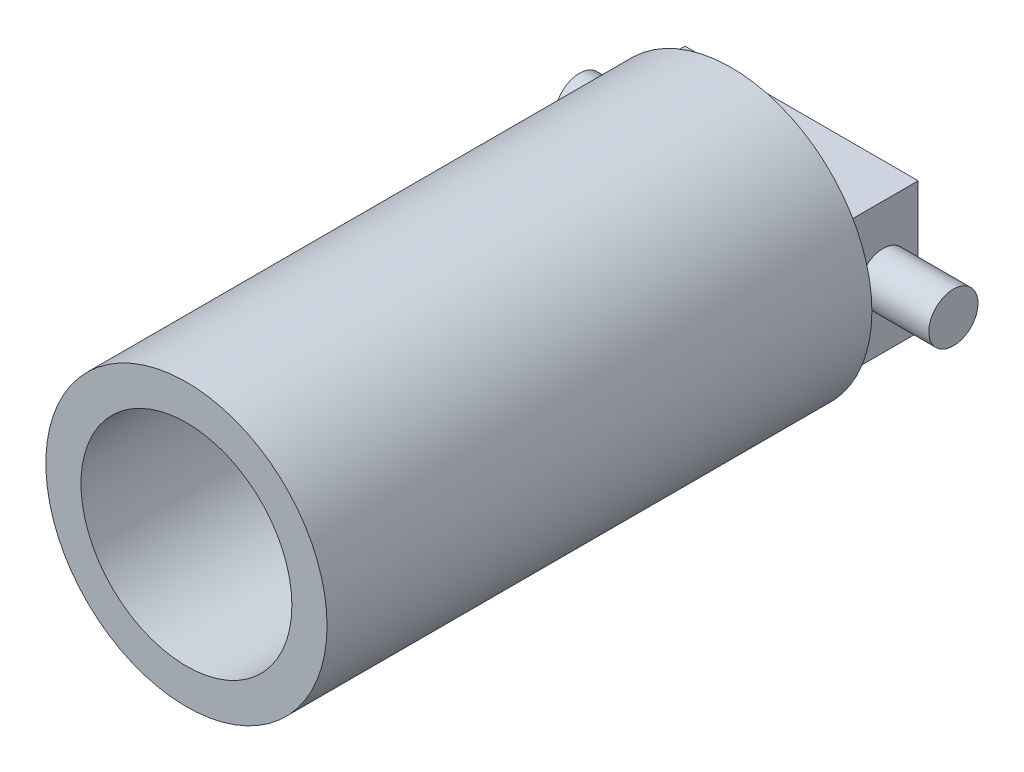
ISO-10303-21;
HEADER;
FILE_DESCRIPTION(('STEP AP214'),'2;1');
FILE_NAME('part.step','',(''),(''),'','','');
FILE_SCHEMA(('AUTOMOTIVE_DESIGN { 1 0 10303 214 1 1 1 1 }'));
ENDSEC;
DATA;
#1=APPLICATION_CONTEXT('core data for automotive mechanical design processes');
#2=APPLICATION_PROTOCOL_DEFINITION('international standard','automotive_design',2000,#1);
#3=PRODUCT_CONTEXT('',#1,'mechanical');
#4=PRODUCT('Part','Part','',(#3));
#5=PRODUCT_RELATED_PRODUCT_CATEGORY('part','',(#4));
#6=PRODUCT_DEFINITION_FORMATION('','',#4);
#7=PRODUCT_DEFINITION_CONTEXT('part definition',#1,'design');
#8=PRODUCT_DEFINITION('design','',#6,#7);
#9=PRODUCT_DEFINITION_SHAPE('','',#8);
#10=(LENGTH_UNIT() NAMED_UNIT(*) SI_UNIT(.MILLI.,.METRE.));
#11=(NAMED_UNIT(*) PLANE_ANGLE_UNIT() SI_UNIT($,.RADIAN.));
#12=(NAMED_UNIT(*) SI_UNIT($,.STERADIAN.) SOLID_ANGLE_UNIT());
#13=UNCERTAINTY_MEASURE_WITH_UNIT(LENGTH_MEASURE(1.E-05),#10,'distance_accuracy_value','');
#14=(GEOMETRIC_REPRESENTATION_CONTEXT(3) GLOBAL_UNCERTAINTY_ASSIGNED_CONTEXT((#13)) GLOBAL_UNIT_ASSIGNED_CONTEXT((#10,
#11,#12)) REPRESENTATION_CONTEXT('',''));
#15=CARTESIAN_POINT('',(0.,0.,0.));
#16=DIRECTION('',(0.,0.,1.));
#17=DIRECTION('',(1.,0.,0.));
#18=AXIS2_PLACEMENT_3D('',#15,#16,#17);
#19=CARTESIAN_POINT('',(0.,0.,0.));
#20=DIRECTION('',(0.,0.,1.));
#21=DIRECTION('',(1.,0.,0.));
#22=AXIS2_PLACEMENT_3D('',#19,#20,#21);
#23=PLANE('',#22);
#24=CARTESIAN_POINT('',(0.,0.,0.));
#25=DIRECTION('',(0.,0.,1.));
#26=DIRECTION('',(1.,0.,0.));
#27=AXIS2_PLACEMENT_3D('',#24,#25,#26);
#28=CIRCLE('',#27,10.16);
#29=CARTESIAN_POINT('',(10.16,0.,0.));
#30=VERTEX_POINT('',#29);
#31=EDGE_CURVE('E126',#30,#30,#28,.T.);
#32=ORIENTED_EDGE('',*,*,#31,.F.);
#33=EDGE_LOOP('',(#32));
#34=FACE_BOUND('',#33,.T.);
#35=DIRECTION('',(0.,1.,0.));
#36=VECTOR('',#35,1.);
#37=CARTESIAN_POINT('',(-8.42913527870695,4.74507265689437,0.));
#38=LINE('',#37,#36);
#39=CARTESIAN_POINT('',(-8.42913527870695,-4.74507265689437,0.));
#40=VERTEX_POINT('',#39);
#41=CARTESIAN_POINT('',(-8.42913527870695,4.74507265689437,0.));
#42=VERTEX_POINT('',#41);
#43=EDGE_CURVE('E59',#40,#42,#38,.T.);
#44=ORIENTED_EDGE('',*,*,#43,.F.);
#45=DIRECTION('',(-1.,0.,0.));
#46=VECTOR('',#45,1.);
#47=CARTESIAN_POINT('',(8.42913527870695,-4.74507265689437,0.));
#48=LINE('',#47,#46);
#49=CARTESIAN_POINT('',(8.42913527870695,-4.74507265689437,0.));
#50=VERTEX_POINT('',#49);
#51=EDGE_CURVE('E63',#50,#40,#48,.T.);
#52=ORIENTED_EDGE('',*,*,#51,.F.);
#53=DIRECTION('',(0.,-1.,0.));
#54=VECTOR('',#53,1.);
#55=CARTESIAN_POINT('',(8.42913527870695,4.74507265689437,0.));
#56=LINE('',#55,#54);
#57=CARTESIAN_POINT('',(8.42913527870695,4.74507265689437,0.));
#58=VERTEX_POINT('',#57);
#59=EDGE_CURVE('E315',#58,#50,#56,.T.);
#60=ORIENTED_EDGE('',*,*,#59,.F.);
#61=DIRECTION('',(1.,0.,0.));
#62=VECTOR('',#61,1.);
#63=CARTESIAN_POINT('',(8.42913527870695,4.74507265689437,0.));
#64=LINE('',#63,#62);
#65=EDGE_CURVE('E312',#42,#58,#64,.T.);
#66=ORIENTED_EDGE('',*,*,#65,.F.);
#67=EDGE_LOOP('',(#44,#52,#60,#66));
#68=FACE_BOUND('',#67,.T.);
#69=ADVANCED_FACE('F43',(#34,#68),#23,.F.);
#70=CARTESIAN_POINT('',(0.,0.,40.64));
#71=DIRECTION('',(0.,0.,-1.));
#72=DIRECTION('',(-1.,0.,0.));
#73=AXIS2_PLACEMENT_3D('',#70,#71,#72);
#74=CYLINDRICAL_SURFACE('',#73,10.16);
#75=ORIENTED_EDGE('',*,*,#31,.T.);
#76=EDGE_LOOP('',(#75));
#77=FACE_BOUND('',#76,.T.);
#78=CARTESIAN_POINT('',(0.,0.,39.37));
#79=DIRECTION('',(0.,0.,1.));
#80=DIRECTION('',(1.,0.,0.));
#81=AXIS2_PLACEMENT_3D('',#78,#79,#80);
#82=CIRCLE('',#81,10.16);
#83=CARTESIAN_POINT('',(10.16,0.,39.37));
#84=VERTEX_POINT('',#83);
#85=EDGE_CURVE('E113',#84,#84,#82,.T.);
#86=ORIENTED_EDGE('',*,*,#85,.F.);
#87=EDGE_LOOP('',(#86));
#88=FACE_BOUND('',#87,.T.);
#89=ADVANCED_FACE('F45',(#77,#88),#74,.T.);
#90=CARTESIAN_POINT('',(0.,0.,39.37));
#91=DIRECTION('',(0.,0.,1.));
#92=DIRECTION('',(1.,0.,0.));
#93=AXIS2_PLACEMENT_3D('',#90,#91,#92);
#94=PLANE('',#93);
#95=CARTESIAN_POINT('',(0.,0.,39.37));
#96=DIRECTION('',(0.,0.,1.));
#97=DIRECTION('',(1.,0.,0.));
#98=AXIS2_PLACEMENT_3D('',#95,#96,#97);
#99=CIRCLE('',#98,7.62);
#100=CARTESIAN_POINT('',(7.62,0.,39.37));
#101=VERTEX_POINT('',#100);
#102=EDGE_CURVE('E108',#101,#101,#99,.T.);
#103=ORIENTED_EDGE('',*,*,#102,.F.);
#104=EDGE_LOOP('',(#103));
#105=FACE_BOUND('',#104,.T.);
#106=ORIENTED_EDGE('',*,*,#85,.T.);
#107=EDGE_LOOP('',(#106));
#108=FACE_BOUND('',#107,.T.);
#109=ADVANCED_FACE('F153',(#105,#108),#94,.T.);
#110=CARTESIAN_POINT('',(0.,0.,39.64));
#111=DIRECTION('',(0.,0.,-1.));
#112=DIRECTION('',(-1.,0.,0.));
#113=AXIS2_PLACEMENT_3D('',#110,#111,#112);
#114=CYLINDRICAL_SURFACE('',#113,7.62);
#115=CARTESIAN_POINT('',(0.,0.,1.));
#116=DIRECTION('',(0.,0.,1.));
#117=DIRECTION('',(1.,0.,0.));
#118=AXIS2_PLACEMENT_3D('',#115,#116,#117);
#119=CIRCLE('',#118,7.62);
#120=CARTESIAN_POINT('',(7.62,0.,1.));
#121=VERTEX_POINT('',#120);
#122=EDGE_CURVE('E122',#121,#121,#119,.T.);
#123=ORIENTED_EDGE('',*,*,#122,.F.);
#124=EDGE_LOOP('',(#123));
#125=FACE_BOUND('',#124,.T.);
#126=ORIENTED_EDGE('',*,*,#102,.T.);
#127=EDGE_LOOP('',(#126));
#128=FACE_BOUND('',#127,.T.);
#129=ADVANCED_FACE('F144',(#125,#128),#114,.F.);
#130=CARTESIAN_POINT('',(0.,0.,1.));
#131=DIRECTION('',(0.,0.,1.));
#132=DIRECTION('',(1.,0.,0.));
#133=AXIS2_PLACEMENT_3D('',#130,#131,#132);
#134=PLANE('',#133);
#135=ORIENTED_EDGE('',*,*,#122,.T.);
#136=EDGE_LOOP('',(#135));
#137=FACE_BOUND('',#136,.T.);
#138=ADVANCED_FACE('F136',(#137),#134,.T.);
#139=CARTESIAN_POINT('',(-8.42913527870695,4.74507265689437,-5.08));
#140=DIRECTION('',(1.,0.,0.));
#141=DIRECTION('',(0.,0.,-1.));
#142=AXIS2_PLACEMENT_3D('',#139,#140,#141);
#143=PLANE('',#142);
#144=CARTESIAN_POINT('',(-8.42913527870695,0.,-2.54));
#145=DIRECTION('',(1.,0.,0.));
#146=DIRECTION('',(0.,0.,-1.));
#147=AXIS2_PLACEMENT_3D('',#144,#145,#146);
#148=CIRCLE('',#147,1.778);
#149=CARTESIAN_POINT('',(-8.42913527870695,0.,-4.318));
#150=VERTEX_POINT('',#149);
#151=EDGE_CURVE('E52',#150,#150,#148,.F.);
#152=ORIENTED_EDGE('',*,*,#151,.F.);
#153=EDGE_LOOP('',(#152));
#154=FACE_BOUND('',#153,.T.);
#155=ORIENTED_EDGE('',*,*,#43,.T.);
#156=DIRECTION('',(0.,0.,1.));
#157=VECTOR('',#156,1.);
#158=CARTESIAN_POINT('',(-8.42913527870695,4.74507265689437,-5.08));
#159=LINE('',#158,#157);
#160=CARTESIAN_POINT('',(-8.42913527870695,4.74507265689437,-5.08));
#161=VERTEX_POINT('',#160);
#162=EDGE_CURVE('E88',#161,#42,#159,.T.);
#163=ORIENTED_EDGE('',*,*,#162,.F.);
#164=DIRECTION('',(0.,1.,0.));
#165=VECTOR('',#164,1.);
#166=CARTESIAN_POINT('',(-8.42913527870695,4.74507265689437,-5.08));
#167=LINE('',#166,#165);
#168=CARTESIAN_POINT('',(-8.42913527870695,-4.74507265689437,-5.08));
#169=VERTEX_POINT('',#168);
#170=EDGE_CURVE('E95',#169,#161,#167,.T.);
#171=ORIENTED_EDGE('',*,*,#170,.F.);
#172=DIRECTION('',(0.,0.,1.));
#173=VECTOR('',#172,1.);
#174=CARTESIAN_POINT('',(-8.42913527870695,-4.74507265689437,-5.08));
#175=LINE('',#174,#173);
#176=EDGE_CURVE('E309',#169,#40,#175,.T.);
#177=ORIENTED_EDGE('',*,*,#176,.T.);
#178=EDGE_LOOP('',(#155,#163,#171,#177));
#179=FACE_BOUND('',#178,.T.);
#180=ADVANCED_FACE('F106',(#154,#179),#143,.F.);
#181=CARTESIAN_POINT('',(8.42913527870695,4.74507265689437,-5.08));
#182=DIRECTION('',(0.,-1.,0.));
#183=DIRECTION('',(0.,0.,-1.));
#184=AXIS2_PLACEMENT_3D('',#181,#182,#183);
#185=PLANE('',#184);
#186=ORIENTED_EDGE('',*,*,#65,.T.);
#187=DIRECTION('',(0.,0.,1.));
#188=VECTOR('',#187,1.);
#189=CARTESIAN_POINT('',(8.42913527870695,4.74507265689437,-5.08));
#190=LINE('',#189,#188);
#191=CARTESIAN_POINT('',(8.42913527870695,4.74507265689437,-5.08));
#192=VERTEX_POINT('',#191);
#193=EDGE_CURVE('E90',#192,#58,#190,.T.);
#194=ORIENTED_EDGE('',*,*,#193,.F.);
#195=DIRECTION('',(1.,0.,0.));
#196=VECTOR('',#195,1.);
#197=CARTESIAN_POINT('',(8.42913527870695,4.74507265689437,-5.08));
#198=LINE('',#197,#196);
#199=EDGE_CURVE('E83',#161,#192,#198,.T.);
#200=ORIENTED_EDGE('',*,*,#199,.F.);
#201=ORIENTED_EDGE('',*,*,#162,.T.);
#202=EDGE_LOOP('',(#186,#194,#200,#201));
#203=FACE_BOUND('',#202,.T.);
#204=ADVANCED_FACE('F86',(#203),#185,.F.);
#205=CARTESIAN_POINT('',(8.42913527870695,4.74507265689437,-5.08));
#206=DIRECTION('',(-1.,0.,0.));
#207=DIRECTION('',(0.,0.,1.));
#208=AXIS2_PLACEMENT_3D('',#205,#206,#207);
#209=PLANE('',#208);
#210=CARTESIAN_POINT('',(8.42913527870695,0.,-2.54));
#211=DIRECTION('',(-1.,0.,0.));
#212=DIRECTION('',(0.,0.,1.));
#213=AXIS2_PLACEMENT_3D('',#210,#211,#212);
#214=CIRCLE('',#213,1.778);
#215=CARTESIAN_POINT('',(8.42913527870695,0.,-0.762));
#216=VERTEX_POINT('',#215);
#217=EDGE_CURVE('E11',#216,#216,#214,.F.);
#218=ORIENTED_EDGE('',*,*,#217,.F.);
#219=EDGE_LOOP('',(#218));
#220=FACE_BOUND('',#219,.T.);
#221=ORIENTED_EDGE('',*,*,#59,.T.);
#222=DIRECTION('',(0.,0.,1.));
#223=VECTOR('',#222,1.);
#224=CARTESIAN_POINT('',(8.42913527870695,-4.74507265689437,-5.08));
#225=LINE('',#224,#223);
#226=CARTESIAN_POINT('',(8.42913527870695,-4.74507265689437,-5.08));
#227=VERTEX_POINT('',#226);
#228=EDGE_CURVE('E115',#227,#50,#225,.T.);
#229=ORIENTED_EDGE('',*,*,#228,.F.);
#230=DIRECTION('',(0.,-1.,0.));
#231=VECTOR('',#230,1.);
#232=CARTESIAN_POINT('',(8.42913527870695,4.74507265689437,-5.08));
#233=LINE('',#232,#231);
#234=EDGE_CURVE('E94',#192,#227,#233,.T.);
#235=ORIENTED_EDGE('',*,*,#234,.F.);
#236=ORIENTED_EDGE('',*,*,#193,.T.);
#237=EDGE_LOOP('',(#221,#229,#235,#236));
#238=FACE_BOUND('',#237,.T.);
#239=ADVANCED_FACE('F142',(#220,#238),#209,.F.);
#240=CARTESIAN_POINT('',(8.42913527870695,-4.74507265689437,-5.08));
#241=DIRECTION('',(0.,1.,0.));
#242=DIRECTION('',(0.,0.,1.));
#243=AXIS2_PLACEMENT_3D('',#240,#241,#242);
#244=PLANE('',#243);
#245=ORIENTED_EDGE('',*,*,#51,.T.);
#246=ORIENTED_EDGE('',*,*,#176,.F.);
#247=DIRECTION('',(-1.,0.,0.));
#248=VECTOR('',#247,1.);
#249=CARTESIAN_POINT('',(8.42913527870695,-4.74507265689437,-5.08));
#250=LINE('',#249,#248);
#251=EDGE_CURVE('E100',#227,#169,#250,.T.);
#252=ORIENTED_EDGE('',*,*,#251,.F.);
#253=ORIENTED_EDGE('',*,*,#228,.T.);
#254=EDGE_LOOP('',(#245,#246,#252,#253));
#255=FACE_BOUND('',#254,.T.);
#256=ADVANCED_FACE('F217',(#255),#244,.F.);
#257=CARTESIAN_POINT('',(0.,0.,-5.08));
#258=DIRECTION('',(0.,0.,-1.));
#259=DIRECTION('',(-1.,0.,0.));
#260=AXIS2_PLACEMENT_3D('',#257,#258,#259);
#261=PLANE('',#260);
#262=ORIENTED_EDGE('',*,*,#170,.T.);
#263=ORIENTED_EDGE('',*,*,#199,.T.);
#264=ORIENTED_EDGE('',*,*,#234,.T.);
#265=ORIENTED_EDGE('',*,*,#251,.T.);
#266=EDGE_LOOP('',(#262,#263,#264,#265));
#267=FACE_BOUND('',#266,.T.);
#268=ADVANCED_FACE('F98',(#267),#261,.T.);
#269=CARTESIAN_POINT('',(-13.509135278707,0.,-2.54));
#270=DIRECTION('',(1.,0.,0.));
#271=DIRECTION('',(0.,0.,-1.));
#272=AXIS2_PLACEMENT_3D('',#269,#270,#271);
#273=CYLINDRICAL_SURFACE('',#272,1.778);
#274=CARTESIAN_POINT('',(-13.509135278707,0.,-2.54));
#275=DIRECTION('',(-1.,0.,0.));
#276=DIRECTION('',(0.,0.,1.));
#277=AXIS2_PLACEMENT_3D('',#274,#275,#276);
#278=CIRCLE('',#277,1.778);
#279=CARTESIAN_POINT('',(-13.509135278707,0.,-0.762));
#280=VERTEX_POINT('',#279);
#281=EDGE_CURVE('E299',#280,#280,#278,.T.);
#282=ORIENTED_EDGE('',*,*,#281,.F.);
#283=EDGE_LOOP('',(#282));
#284=FACE_BOUND('',#283,.T.);
#285=ORIENTED_EDGE('',*,*,#151,.T.);
#286=EDGE_LOOP('',(#285));
#287=FACE_BOUND('',#286,.T.);
#288=ADVANCED_FACE('F133',(#284,#287),#273,.T.);
#289=CARTESIAN_POINT('',(-13.509135278707,0.,-2.54));
#290=DIRECTION('',(-1.,0.,0.));
#291=DIRECTION('',(0.,0.,1.));
#292=AXIS2_PLACEMENT_3D('',#289,#290,#291);
#293=PLANE('',#292);
#294=ORIENTED_EDGE('',*,*,#281,.T.);
#295=EDGE_LOOP('',(#294));
#296=FACE_BOUND('',#295,.T.);
#297=ADVANCED_FACE('F244',(#296),#293,.T.);
#298=CARTESIAN_POINT('',(13.509135278707,0.,-2.54));
#299=DIRECTION('',(-1.,0.,0.));
#300=DIRECTION('',(0.,0.,1.));
#301=AXIS2_PLACEMENT_3D('',#298,#299,#300);
#302=CYLINDRICAL_SURFACE('',#301,1.778);
#303=CARTESIAN_POINT('',(13.509135278707,0.,-2.54));
#304=DIRECTION('',(1.,0.,0.));
#305=DIRECTION('',(0.,0.,-1.));
#306=AXIS2_PLACEMENT_3D('',#303,#304,#305);
#307=CIRCLE('',#306,1.778);
#308=CARTESIAN_POINT('',(13.509135278707,0.,-4.318));
#309=VERTEX_POINT('',#308);
#310=EDGE_CURVE('E297',#309,#309,#307,.T.);
#311=ORIENTED_EDGE('',*,*,#310,.F.);
#312=EDGE_LOOP('',(#311));
#313=FACE_BOUND('',#312,.T.);
#314=ORIENTED_EDGE('',*,*,#217,.T.);
#315=EDGE_LOOP('',(#314));
#316=FACE_BOUND('',#315,.T.);
#317=ADVANCED_FACE('F254',(#313,#316),#302,.T.);
#318=CARTESIAN_POINT('',(13.509135278707,0.,-2.54));
#319=DIRECTION('',(1.,0.,0.));
#320=DIRECTION('',(0.,0.,-1.));
#321=AXIS2_PLACEMENT_3D('',#318,#319,#320);
#322=PLANE('',#321);
#323=ORIENTED_EDGE('',*,*,#310,.T.);
#324=EDGE_LOOP('',(#323));
#325=FACE_BOUND('',#324,.T.);
#326=ADVANCED_FACE('F264',(#325),#322,.T.);
#327=CLOSED_SHELL('',(#69,#89,#109,#129,#138,#180,#204,#239,#256,#268,#288,#297,#317,#326));
#328=MANIFOLD_SOLID_BREP('B2',#327);
#329=ADVANCED_BREP_SHAPE_REPRESENTATION('',(#18,#328),#14);
#330=SHAPE_DEFINITION_REPRESENTATION(#9,#329);
ENDSEC;
END-ISO-10303-21;
